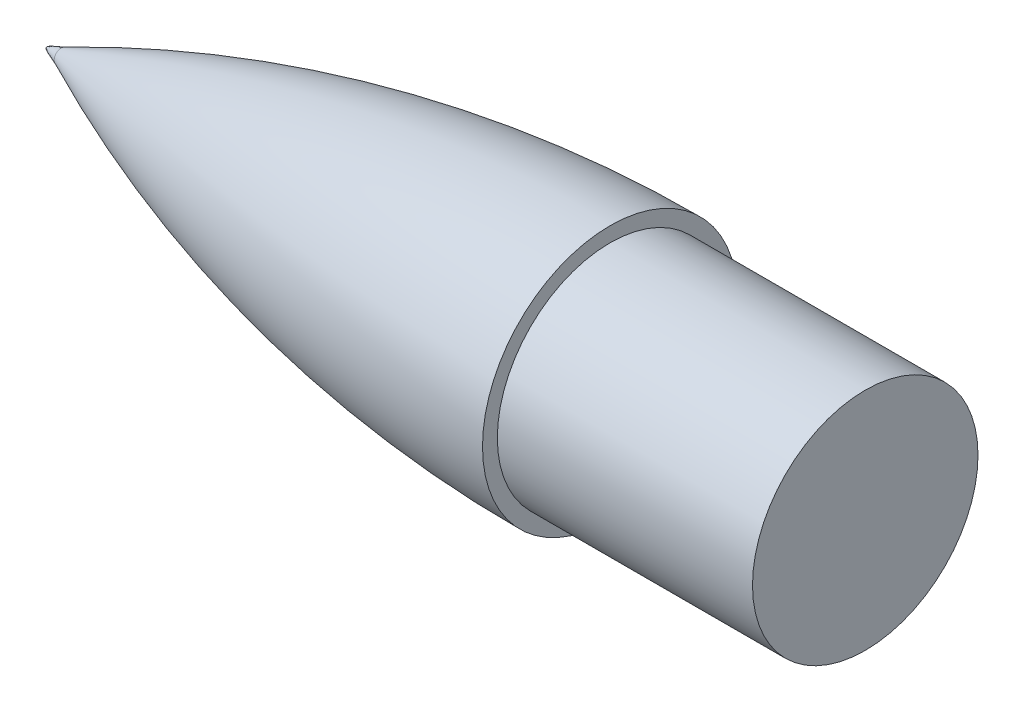
ISO-10303-21;
HEADER;
FILE_DESCRIPTION(('STEP AP214'),'2;1');
FILE_NAME('part.step','',(''),(''),'','','');
FILE_SCHEMA(('AUTOMOTIVE_DESIGN { 1 0 10303 214 1 1 1 1 }'));
ENDSEC;
DATA;
#1=APPLICATION_CONTEXT('core data for automotive mechanical design processes');
#2=APPLICATION_PROTOCOL_DEFINITION('international standard','automotive_design',2000,#1);
#3=PRODUCT_CONTEXT('',#1,'mechanical');
#4=PRODUCT('Part','Part','',(#3));
#5=PRODUCT_RELATED_PRODUCT_CATEGORY('part','',(#4));
#6=PRODUCT_DEFINITION_FORMATION('','',#4);
#7=PRODUCT_DEFINITION_CONTEXT('part definition',#1,'design');
#8=PRODUCT_DEFINITION('design','',#6,#7);
#9=PRODUCT_DEFINITION_SHAPE('','',#8);
#10=(LENGTH_UNIT() NAMED_UNIT(*) SI_UNIT(.MILLI.,.METRE.));
#11=(NAMED_UNIT(*) PLANE_ANGLE_UNIT() SI_UNIT($,.RADIAN.));
#12=(NAMED_UNIT(*) SI_UNIT($,.STERADIAN.) SOLID_ANGLE_UNIT());
#13=UNCERTAINTY_MEASURE_WITH_UNIT(LENGTH_MEASURE(1.E-05),#10,'distance_accuracy_value','');
#14=(GEOMETRIC_REPRESENTATION_CONTEXT(3) GLOBAL_UNCERTAINTY_ASSIGNED_CONTEXT((#13)) GLOBAL_UNIT_ASSIGNED_CONTEXT((#10,
#11,#12)) REPRESENTATION_CONTEXT('',''));
#15=CARTESIAN_POINT('',(0.,0.,0.));
#16=DIRECTION('',(0.,0.,1.));
#17=DIRECTION('',(1.,0.,0.));
#18=AXIS2_PLACEMENT_3D('',#15,#16,#17);
#19=CARTESIAN_POINT('',(0.,398.267441860465,0.));
#20=DIRECTION('',(1.,0.,0.));
#21=DIRECTION('',(0.,0.,-1.));
#22=AXIS2_PLACEMENT_3D('',#19,#20,#21);
#23=DEGENERATE_TOROIDAL_SURFACE('',#22,398.267441860465,441.267441860465,.F.);
#24=CARTESIAN_POINT('',(0.,398.267441860465,0.));
#25=DIRECTION('',(1.,0.,0.));
#26=DIRECTION('',(0.,0.,-1.));
#27=AXIS2_PLACEMENT_3D('',#24,#25,#26);
#28=CIRCLE('',#27,43.);
#29=CARTESIAN_POINT('',(0.,398.267441860465,-43.));
#30=VERTEX_POINT('',#29);
#31=EDGE_CURVE('E63',#30,#30,#28,.T.);
#32=ORIENTED_EDGE('',*,*,#31,.F.);
#33=EDGE_LOOP('',(#32));
#34=FACE_BOUND('',#33,.T.);
#35=CARTESIAN_POINT('',(-185.,398.267441860465,0.));
#36=DIRECTION('',(-1.,0.,0.));
#37=DIRECTION('',(0.,-1.,0.));
#38=AXIS2_PLACEMENT_3D('',#35,#36,#37);
#39=CIRCLE('',#38,2.34703022720045);
#40=CARTESIAN_POINT('',(-185.,395.920411633264,0.));
#41=VERTEX_POINT('',#40);
#42=EDGE_CURVE('E61',#41,#41,#39,.T.);
#43=ORIENTED_EDGE('',*,*,#42,.F.);
#44=EDGE_LOOP('',(#43));
#45=FACE_BOUND('',#44,.T.);
#46=ADVANCED_FACE('F40',(#34,#45),#23,.F.);
#47=CARTESIAN_POINT('',(86.,436.267441860465,0.));
#48=DIRECTION('',(1.,0.,0.));
#49=DIRECTION('',(0.,0.,-1.));
#50=AXIS2_PLACEMENT_3D('',#47,#48,#49);
#51=PLANE('',#50);
#52=CARTESIAN_POINT('',(86.,398.267441860465,0.));
#53=DIRECTION('',(1.,0.,0.));
#54=DIRECTION('',(0.,0.,-1.));
#55=AXIS2_PLACEMENT_3D('',#52,#53,#54);
#56=CIRCLE('',#55,38.);
#57=CARTESIAN_POINT('',(86.,398.267441860465,-38.));
#58=VERTEX_POINT('',#57);
#59=EDGE_CURVE('E75',#58,#58,#56,.T.);
#60=ORIENTED_EDGE('',*,*,#59,.T.);
#61=EDGE_LOOP('',(#60));
#62=FACE_BOUND('',#61,.T.);
#63=ADVANCED_FACE('F134',(#62),#51,.T.);
#64=CARTESIAN_POINT('',(-190.,398.267441860465,0.));
#65=DIRECTION('',(1.,0.,0.));
#66=DIRECTION('',(0.,0.,-1.));
#67=AXIS2_PLACEMENT_3D('',#64,#65,#66);
#68=CYLINDRICAL_SURFACE('',#67,38.);
#69=CARTESIAN_POINT('',(0.,398.267441860465,0.));
#70=DIRECTION('',(1.,0.,0.));
#71=DIRECTION('',(0.,0.,-1.));
#72=AXIS2_PLACEMENT_3D('',#69,#70,#71);
#73=CIRCLE('',#72,38.);
#74=CARTESIAN_POINT('',(0.,398.267441860465,-38.));
#75=VERTEX_POINT('',#74);
#76=EDGE_CURVE('E66',#75,#75,#73,.T.);
#77=ORIENTED_EDGE('',*,*,#76,.T.);
#78=EDGE_LOOP('',(#77));
#79=FACE_BOUND('',#78,.T.);
#80=ORIENTED_EDGE('',*,*,#59,.F.);
#81=EDGE_LOOP('',(#80));
#82=FACE_BOUND('',#81,.T.);
#83=ADVANCED_FACE('F144',(#79,#82),#68,.T.);
#84=CARTESIAN_POINT('',(0.,441.267441860465,0.));
#85=DIRECTION('',(1.,0.,0.));
#86=DIRECTION('',(0.,0.,-1.));
#87=AXIS2_PLACEMENT_3D('',#84,#85,#86);
#88=PLANE('',#87);
#89=ORIENTED_EDGE('',*,*,#31,.T.);
#90=EDGE_LOOP('',(#89));
#91=FACE_BOUND('',#90,.T.);
#92=ORIENTED_EDGE('',*,*,#76,.F.);
#93=EDGE_LOOP('',(#92));
#94=FACE_BOUND('',#93,.T.);
#95=ADVANCED_FACE('F57',(#91,#94),#88,.T.);
#96=CARTESIAN_POINT('',(-185.,400.614472087665,0.));
#97=CARTESIAN_POINT('',(-188.204291585138,399.407953228302,0.));
#98=CARTESIAN_POINT('',(-189.935479125885,398.837697544372,0.));
#99=CARTESIAN_POINT('',(-190.,398.267441860465,0.));
#100=B_SPLINE_CURVE_WITH_KNOTS('',3,(#96,#97,#98,#99),.UNSPECIFIED.,.F.,.F.,(4,4),(0.,
0.499999999994947),.UNSPECIFIED.);
#101=CARTESIAN_POINT('',(-185.,398.267441860465,0.));
#102=DIRECTION('',(1.,0.,0.));
#103=AXIS1_PLACEMENT('',#101,#102);
#104=SURFACE_OF_REVOLUTION('',#100,#103);
#105=CARTESIAN_POINT('',(-190.,398.267441860465,0.));
#106=VERTEX_POINT('',#105);
#107=VERTEX_LOOP('',#106);
#108=FACE_BOUND('',#107,.T.);
#109=ORIENTED_EDGE('',*,*,#42,.T.);
#110=EDGE_LOOP('',(#109));
#111=FACE_BOUND('',#110,.T.);
#112=ADVANCED_FACE('F54',(#108,#111),#104,.F.);
#113=CLOSED_SHELL('',(#46,#63,#83,#95,#112));
#114=CARTESIAN_POINT('',(0.,398.267441860465,398.267441860465));
#115=DIRECTION('',(0.,-1.,0.));
#116=DIRECTION('',(0.,0.,-1.));
#117=AXIS2_PLACEMENT_3D('',#114,#115,#116);
#118=CIRCLE('',#117,436.267441860465);
#119=TRIMMED_CURVE('',#118,(PARAMETER_VALUE(-0.420469330632792)),
(PARAMETER_VALUE(0.420469330632792)),.T.,.PARAMETER.);
#120=CARTESIAN_POINT('',(0.,398.267441860465,0.));
#121=DIRECTION('',(1.,0.,0.));
#122=AXIS1_PLACEMENT('',#120,#121);
#123=SURFACE_OF_REVOLUTION('',#119,#122);
#124=CARTESIAN_POINT('',(-5.,398.267441860465,0.));
#125=DIRECTION('',(1.,0.,0.));
#126=DIRECTION('',(0.,0.,-1.));
#127=AXIS2_PLACEMENT_3D('',#124,#125,#126);
#128=CIRCLE('',#127,37.9713469094863);
#129=CARTESIAN_POINT('',(-5.,398.267441860465,-37.9713469094863));
#130=VERTEX_POINT('',#129);
#131=EDGE_CURVE('E11',#130,#130,#128,.T.);
#132=ORIENTED_EDGE('',*,*,#131,.T.);
#133=EDGE_LOOP('',(#132));
#134=FACE_BOUND('',#133,.T.);
#135=CARTESIAN_POINT('',(-178.079548464711,398.267441860465,0.));
#136=VERTEX_POINT('',#135);
#137=VERTEX_LOOP('',#136);
#138=FACE_BOUND('',#137,.T.);
#139=ADVANCED_FACE('F98',(#134,#138),#123,.F.);
#140=CARTESIAN_POINT('',(-5.,436.238788769951,0.));
#141=DIRECTION('',(-1.,0.,0.));
#142=DIRECTION('',(0.,0.,1.));
#143=AXIS2_PLACEMENT_3D('',#140,#141,#142);
#144=PLANE('',#143);
#145=CARTESIAN_POINT('',(-5.,398.267441860465,0.));
#146=DIRECTION('',(1.,0.,0.));
#147=DIRECTION('',(0.,0.,-1.));
#148=AXIS2_PLACEMENT_3D('',#145,#146,#147);
#149=CIRCLE('',#148,33.);
#150=CARTESIAN_POINT('',(-5.,398.267441860465,-33.));
#151=VERTEX_POINT('',#150);
#152=EDGE_CURVE('E48',#151,#151,#149,.T.);
#153=ORIENTED_EDGE('',*,*,#152,.T.);
#154=EDGE_LOOP('',(#153));
#155=FACE_BOUND('',#154,.T.);
#156=ORIENTED_EDGE('',*,*,#131,.F.);
#157=EDGE_LOOP('',(#156));
#158=FACE_BOUND('',#157,.T.);
#159=ADVANCED_FACE('F83',(#155,#158),#144,.T.);
#160=CARTESIAN_POINT('',(-190.,398.267441860465,0.));
#161=DIRECTION('',(1.,0.,0.));
#162=DIRECTION('',(0.,0.,-1.));
#163=AXIS2_PLACEMENT_3D('',#160,#161,#162);
#164=CYLINDRICAL_SURFACE('',#163,33.);
#165=CARTESIAN_POINT('',(81.,398.267441860465,0.));
#166=DIRECTION('',(1.,0.,0.));
#167=DIRECTION('',(0.,0.,-1.));
#168=AXIS2_PLACEMENT_3D('',#165,#166,#167);
#169=CIRCLE('',#168,33.);
#170=CARTESIAN_POINT('',(81.,398.267441860465,-33.));
#171=VERTEX_POINT('',#170);
#172=EDGE_CURVE('E78',#171,#171,#169,.T.);
#173=ORIENTED_EDGE('',*,*,#172,.T.);
#174=EDGE_LOOP('',(#173));
#175=FACE_BOUND('',#174,.T.);
#176=ORIENTED_EDGE('',*,*,#152,.F.);
#177=EDGE_LOOP('',(#176));
#178=FACE_BOUND('',#177,.T.);
#179=ADVANCED_FACE('F86',(#175,#178),#164,.F.);
#180=CARTESIAN_POINT('',(81.,398.267441860465,0.));
#181=DIRECTION('',(-1.,0.,0.));
#182=DIRECTION('',(0.,0.,1.));
#183=AXIS2_PLACEMENT_3D('',#180,#181,#182);
#184=PLANE('',#183);
#185=ORIENTED_EDGE('',*,*,#172,.F.);
#186=EDGE_LOOP('',(#185));
#187=FACE_BOUND('',#186,.T.);
#188=ADVANCED_FACE('F88',(#187),#184,.T.);
#189=CLOSED_SHELL('',(#139,#159,#179,#188));
#190=ORIENTED_CLOSED_SHELL('',*,#189,.T.);
#191=BREP_WITH_VOIDS('B2',#113,(#190));
#192=ADVANCED_BREP_SHAPE_REPRESENTATION('',(#18,#191),#14);
#193=SHAPE_DEFINITION_REPRESENTATION(#9,#192);
ENDSEC;
END-ISO-10303-21;
